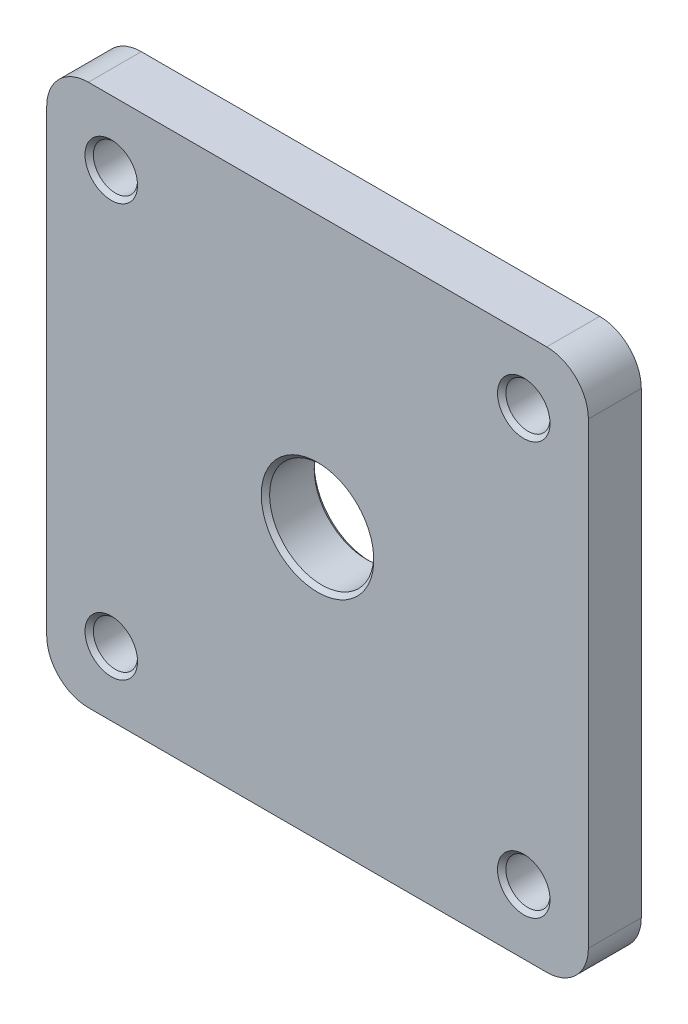
ISO-10303-21;
HEADER;
FILE_DESCRIPTION(('STEP AP214'),'2;1');
FILE_NAME('part.step','',(''),(''),'','','');
FILE_SCHEMA(('AUTOMOTIVE_DESIGN { 1 0 10303 214 1 1 1 1 }'));
ENDSEC;
DATA;
#1=APPLICATION_CONTEXT('core data for automotive mechanical design processes');
#2=APPLICATION_PROTOCOL_DEFINITION('international standard','automotive_design',2000,#1);
#3=PRODUCT_CONTEXT('',#1,'mechanical');
#4=PRODUCT('Part','Part','',(#3));
#5=PRODUCT_RELATED_PRODUCT_CATEGORY('part','',(#4));
#6=PRODUCT_DEFINITION_FORMATION('','',#4);
#7=PRODUCT_DEFINITION_CONTEXT('part definition',#1,'design');
#8=PRODUCT_DEFINITION('design','',#6,#7);
#9=PRODUCT_DEFINITION_SHAPE('','',#8);
#10=(LENGTH_UNIT() NAMED_UNIT(*) SI_UNIT(.MILLI.,.METRE.));
#11=(NAMED_UNIT(*) PLANE_ANGLE_UNIT() SI_UNIT($,.RADIAN.));
#12=(NAMED_UNIT(*) SI_UNIT($,.STERADIAN.) SOLID_ANGLE_UNIT());
#13=UNCERTAINTY_MEASURE_WITH_UNIT(LENGTH_MEASURE(1.E-05),#10,'distance_accuracy_value','');
#14=(GEOMETRIC_REPRESENTATION_CONTEXT(3) GLOBAL_UNCERTAINTY_ASSIGNED_CONTEXT((#13)) GLOBAL_UNIT_ASSIGNED_CONTEXT((#10,
#11,#12)) REPRESENTATION_CONTEXT('',''));
#15=CARTESIAN_POINT('',(0.,0.,0.));
#16=DIRECTION('',(0.,0.,1.));
#17=DIRECTION('',(1.,0.,0.));
#18=AXIS2_PLACEMENT_3D('',#15,#16,#17);
#19=CARTESIAN_POINT('',(0.,0.,3.175));
#20=DIRECTION('',(0.,0.,-1.));
#21=DIRECTION('',(-1.,0.,0.));
#22=AXIS2_PLACEMENT_3D('',#19,#20,#21);
#23=PLANE('',#22);
#24=CARTESIAN_POINT('',(-24.7487373415291,-24.7487373415292,3.175));
#25=DIRECTION('',(0.,0.,-1.));
#26=DIRECTION('',(-1.,0.,0.));
#27=AXIS2_PLACEMENT_3D('',#24,#25,#26);
#28=CIRCLE('',#27,3.14999999999999);
#29=CARTESIAN_POINT('',(-27.8987373415291,-24.7487373415292,3.175));
#30=VERTEX_POINT('',#29);
#31=EDGE_CURVE('E232',#30,#30,#28,.T.);
#32=ORIENTED_EDGE('',*,*,#31,.T.);
#33=EDGE_LOOP('',(#32));
#34=FACE_BOUND('',#33,.T.);
#35=CARTESIAN_POINT('',(24.7487373415292,-24.7487373415291,3.175));
#36=DIRECTION('',(0.,0.,-1.));
#37=DIRECTION('',(-1.,0.,0.));
#38=AXIS2_PLACEMENT_3D('',#35,#36,#37);
#39=CIRCLE('',#38,3.14999999999999);
#40=CARTESIAN_POINT('',(21.5987373415292,-24.7487373415291,3.175));
#41=VERTEX_POINT('',#40);
#42=EDGE_CURVE('E228',#41,#41,#39,.T.);
#43=ORIENTED_EDGE('',*,*,#42,.T.);
#44=EDGE_LOOP('',(#43));
#45=FACE_BOUND('',#44,.T.);
#46=CARTESIAN_POINT('',(24.7487373415291,24.7487373415292,3.175));
#47=DIRECTION('',(0.,0.,-1.));
#48=DIRECTION('',(-1.,0.,0.));
#49=AXIS2_PLACEMENT_3D('',#46,#47,#48);
#50=CIRCLE('',#49,3.14999999999999);
#51=CARTESIAN_POINT('',(21.5987373415291,24.7487373415292,3.175));
#52=VERTEX_POINT('',#51);
#53=EDGE_CURVE('E224',#52,#52,#50,.T.);
#54=ORIENTED_EDGE('',*,*,#53,.T.);
#55=EDGE_LOOP('',(#54));
#56=FACE_BOUND('',#55,.T.);
#57=CARTESIAN_POINT('',(-24.7487373415292,24.7487373415291,3.175));
#58=DIRECTION('',(0.,0.,-1.));
#59=DIRECTION('',(-1.,0.,0.));
#60=AXIS2_PLACEMENT_3D('',#57,#58,#59);
#61=CIRCLE('',#60,3.14999999999999);
#62=CARTESIAN_POINT('',(-27.8987373415292,24.7487373415291,3.175));
#63=VERTEX_POINT('',#62);
#64=EDGE_CURVE('E220',#63,#63,#61,.T.);
#65=ORIENTED_EDGE('',*,*,#64,.T.);
#66=EDGE_LOOP('',(#65));
#67=FACE_BOUND('',#66,.T.);
#68=CARTESIAN_POINT('',(0.,0.,3.175));
#69=DIRECTION('',(0.,0.,-1.));
#70=DIRECTION('',(-1.,0.,0.));
#71=AXIS2_PLACEMENT_3D('',#68,#69,#70);
#72=CIRCLE('',#71,6.75000000000001);
#73=CARTESIAN_POINT('',(-6.75000000000001,0.,3.175));
#74=VERTEX_POINT('',#73);
#75=EDGE_CURVE('E216',#74,#74,#72,.T.);
#76=ORIENTED_EDGE('',*,*,#75,.T.);
#77=EDGE_LOOP('',(#76));
#78=FACE_BOUND('',#77,.T.);
#79=DIRECTION('',(0.,-1.,0.));
#80=VECTOR('',#79,1.);
#81=CARTESIAN_POINT('',(-32.5,-32.5,3.175));
#82=LINE('',#81,#80);
#83=CARTESIAN_POINT('',(-32.5,27.5,3.175));
#84=VERTEX_POINT('',#83);
#85=CARTESIAN_POINT('',(-32.5,-27.5,3.175));
#86=VERTEX_POINT('',#85);
#87=EDGE_CURVE('E613',#84,#86,#82,.T.);
#88=ORIENTED_EDGE('',*,*,#87,.T.);
#89=CARTESIAN_POINT('',(-27.5,-27.5,3.175));
#90=DIRECTION('',(0.,0.,-1.));
#91=DIRECTION('',(-1.,0.,0.));
#92=AXIS2_PLACEMENT_3D('',#89,#90,#91);
#93=CIRCLE('',#92,5.);
#94=CARTESIAN_POINT('',(-27.5,-32.5,3.175));
#95=VERTEX_POINT('',#94);
#96=EDGE_CURVE('E172',#86,#95,#93,.F.);
#97=ORIENTED_EDGE('',*,*,#96,.T.);
#98=DIRECTION('',(1.,0.,0.));
#99=VECTOR('',#98,1.);
#100=CARTESIAN_POINT('',(-32.5,-32.5,3.175));
#101=LINE('',#100,#99);
#102=CARTESIAN_POINT('',(27.5,-32.5,3.175));
#103=VERTEX_POINT('',#102);
#104=EDGE_CURVE('E130',#95,#103,#101,.T.);
#105=ORIENTED_EDGE('',*,*,#104,.T.);
#106=CARTESIAN_POINT('',(27.5,-27.5,3.175));
#107=DIRECTION('',(0.,0.,-1.));
#108=DIRECTION('',(-1.,0.,0.));
#109=AXIS2_PLACEMENT_3D('',#106,#107,#108);
#110=CIRCLE('',#109,5.);
#111=CARTESIAN_POINT('',(32.5,-27.5,3.175));
#112=VERTEX_POINT('',#111);
#113=EDGE_CURVE('E166',#103,#112,#110,.F.);
#114=ORIENTED_EDGE('',*,*,#113,.T.);
#115=DIRECTION('',(0.,1.,0.));
#116=VECTOR('',#115,1.);
#117=CARTESIAN_POINT('',(32.5,-32.5,3.175));
#118=LINE('',#117,#116);
#119=CARTESIAN_POINT('',(32.5,27.5,3.175));
#120=VERTEX_POINT('',#119);
#121=EDGE_CURVE('E139',#112,#120,#118,.T.);
#122=ORIENTED_EDGE('',*,*,#121,.T.);
#123=CARTESIAN_POINT('',(27.5,27.5,3.175));
#124=DIRECTION('',(0.,0.,-1.));
#125=DIRECTION('',(-1.,0.,0.));
#126=AXIS2_PLACEMENT_3D('',#123,#124,#125);
#127=CIRCLE('',#126,5.);
#128=CARTESIAN_POINT('',(27.5,32.5,3.175));
#129=VERTEX_POINT('',#128);
#130=EDGE_CURVE('E64',#120,#129,#127,.F.);
#131=ORIENTED_EDGE('',*,*,#130,.T.);
#132=DIRECTION('',(-1.,0.,0.));
#133=VECTOR('',#132,1.);
#134=CARTESIAN_POINT('',(-32.5,32.5,3.175));
#135=LINE('',#134,#133);
#136=CARTESIAN_POINT('',(-27.5,32.5,3.175));
#137=VERTEX_POINT('',#136);
#138=EDGE_CURVE('E145',#129,#137,#135,.T.);
#139=ORIENTED_EDGE('',*,*,#138,.T.);
#140=CARTESIAN_POINT('',(-27.5,27.5,3.175));
#141=DIRECTION('',(0.,0.,-1.));
#142=DIRECTION('',(-1.,0.,0.));
#143=AXIS2_PLACEMENT_3D('',#140,#141,#142);
#144=CIRCLE('',#143,5.);
#145=EDGE_CURVE('E169',#137,#84,#144,.F.);
#146=ORIENTED_EDGE('',*,*,#145,.T.);
#147=EDGE_LOOP('',(#88,#97,#105,#114,#122,#131,#139,#146));
#148=FACE_BOUND('',#147,.T.);
#149=ADVANCED_FACE('F40',(#34,#45,#56,#67,#78,#148),#23,.F.);
#150=CARTESIAN_POINT('',(32.5,-32.5,3.175));
#151=DIRECTION('',(-1.,0.,0.));
#152=DIRECTION('',(0.,0.,1.));
#153=AXIS2_PLACEMENT_3D('',#150,#151,#152);
#154=PLANE('',#153);
#155=ORIENTED_EDGE('',*,*,#121,.F.);
#156=DIRECTION('',(0.,0.,-1.));
#157=VECTOR('',#156,1.);
#158=CARTESIAN_POINT('',(32.5,-27.5,3.175));
#159=LINE('',#158,#157);
#160=CARTESIAN_POINT('',(32.5,-27.5,-3.175));
#161=VERTEX_POINT('',#160);
#162=EDGE_CURVE('E184',#112,#161,#159,.T.);
#163=ORIENTED_EDGE('',*,*,#162,.T.);
#164=DIRECTION('',(0.,1.,0.));
#165=VECTOR('',#164,1.);
#166=CARTESIAN_POINT('',(32.5,-32.5,-3.175));
#167=LINE('',#166,#165);
#168=CARTESIAN_POINT('',(32.5,27.5,-3.175));
#169=VERTEX_POINT('',#168);
#170=EDGE_CURVE('E624',#161,#169,#167,.T.);
#171=ORIENTED_EDGE('',*,*,#170,.T.);
#172=DIRECTION('',(0.,0.,-1.));
#173=VECTOR('',#172,1.);
#174=CARTESIAN_POINT('',(32.5,27.5,3.175));
#175=LINE('',#174,#173);
#176=EDGE_CURVE('E181',#169,#120,#175,.F.);
#177=ORIENTED_EDGE('',*,*,#176,.T.);
#178=EDGE_LOOP('',(#155,#163,#171,#177));
#179=FACE_BOUND('',#178,.T.);
#180=ADVANCED_FACE('F276',(#179),#154,.F.);
#181=CARTESIAN_POINT('',(-32.5,32.5,3.175));
#182=DIRECTION('',(0.,-1.,0.));
#183=DIRECTION('',(0.,0.,-1.));
#184=AXIS2_PLACEMENT_3D('',#181,#182,#183);
#185=PLANE('',#184);
#186=DIRECTION('',(-1.,0.,0.));
#187=VECTOR('',#186,1.);
#188=CARTESIAN_POINT('',(-32.5,32.5,-3.175));
#189=LINE('',#188,#187);
#190=CARTESIAN_POINT('',(27.5,32.5,-3.175));
#191=VERTEX_POINT('',#190);
#192=CARTESIAN_POINT('',(-27.5,32.5,-3.175));
#193=VERTEX_POINT('',#192);
#194=EDGE_CURVE('E147',#191,#193,#189,.T.);
#195=ORIENTED_EDGE('',*,*,#194,.T.);
#196=DIRECTION('',(0.,0.,-1.));
#197=VECTOR('',#196,1.);
#198=CARTESIAN_POINT('',(-27.5,32.5,3.175));
#199=LINE('',#198,#197);
#200=EDGE_CURVE('E57',#193,#137,#199,.F.);
#201=ORIENTED_EDGE('',*,*,#200,.T.);
#202=ORIENTED_EDGE('',*,*,#138,.F.);
#203=DIRECTION('',(0.,0.,-1.));
#204=VECTOR('',#203,1.);
#205=CARTESIAN_POINT('',(27.5,32.5,3.175));
#206=LINE('',#205,#204);
#207=EDGE_CURVE('E175',#129,#191,#206,.T.);
#208=ORIENTED_EDGE('',*,*,#207,.T.);
#209=EDGE_LOOP('',(#195,#201,#202,#208));
#210=FACE_BOUND('',#209,.T.);
#211=ADVANCED_FACE('F282',(#210),#185,.F.);
#212=CARTESIAN_POINT('',(-32.5,-32.5,3.175));
#213=DIRECTION('',(1.,0.,0.));
#214=DIRECTION('',(0.,0.,-1.));
#215=AXIS2_PLACEMENT_3D('',#212,#213,#214);
#216=PLANE('',#215);
#217=DIRECTION('',(0.,-1.,0.));
#218=VECTOR('',#217,1.);
#219=CARTESIAN_POINT('',(-32.5,-32.5,-3.175));
#220=LINE('',#219,#218);
#221=CARTESIAN_POINT('',(-32.5,27.5,-3.175));
#222=VERTEX_POINT('',#221);
#223=CARTESIAN_POINT('',(-32.5,-27.5,-3.175));
#224=VERTEX_POINT('',#223);
#225=EDGE_CURVE('E140',#222,#224,#220,.T.);
#226=ORIENTED_EDGE('',*,*,#225,.T.);
#227=DIRECTION('',(0.,0.,-1.));
#228=VECTOR('',#227,1.);
#229=CARTESIAN_POINT('',(-32.5,-27.5,3.175));
#230=LINE('',#229,#228);
#231=EDGE_CURVE('E114',#224,#86,#230,.F.);
#232=ORIENTED_EDGE('',*,*,#231,.T.);
#233=ORIENTED_EDGE('',*,*,#87,.F.);
#234=DIRECTION('',(0.,0.,-1.));
#235=VECTOR('',#234,1.);
#236=CARTESIAN_POINT('',(-32.5,27.5,3.175));
#237=LINE('',#236,#235);
#238=EDGE_CURVE('E120',#84,#222,#237,.T.);
#239=ORIENTED_EDGE('',*,*,#238,.T.);
#240=EDGE_LOOP('',(#226,#232,#233,#239));
#241=FACE_BOUND('',#240,.T.);
#242=ADVANCED_FACE('F294',(#241),#216,.F.);
#243=CARTESIAN_POINT('',(-32.5,-32.5,3.175));
#244=DIRECTION('',(0.,1.,0.));
#245=DIRECTION('',(0.,0.,1.));
#246=AXIS2_PLACEMENT_3D('',#243,#244,#245);
#247=PLANE('',#246);
#248=ORIENTED_EDGE('',*,*,#104,.F.);
#249=DIRECTION('',(0.,0.,-1.));
#250=VECTOR('',#249,1.);
#251=CARTESIAN_POINT('',(-27.5,-32.5,3.175));
#252=LINE('',#251,#250);
#253=CARTESIAN_POINT('',(-27.5,-32.5,-3.175));
#254=VERTEX_POINT('',#253);
#255=EDGE_CURVE('E113',#95,#254,#252,.T.);
#256=ORIENTED_EDGE('',*,*,#255,.T.);
#257=DIRECTION('',(1.,0.,0.));
#258=VECTOR('',#257,1.);
#259=CARTESIAN_POINT('',(-32.5,-32.5,-3.175));
#260=LINE('',#259,#258);
#261=CARTESIAN_POINT('',(27.5,-32.5,-3.175));
#262=VERTEX_POINT('',#261);
#263=EDGE_CURVE('E127',#254,#262,#260,.T.);
#264=ORIENTED_EDGE('',*,*,#263,.T.);
#265=DIRECTION('',(0.,0.,-1.));
#266=VECTOR('',#265,1.);
#267=CARTESIAN_POINT('',(27.5,-32.5,3.175));
#268=LINE('',#267,#266);
#269=EDGE_CURVE('E133',#262,#103,#268,.F.);
#270=ORIENTED_EDGE('',*,*,#269,.T.);
#271=EDGE_LOOP('',(#248,#256,#264,#270));
#272=FACE_BOUND('',#271,.T.);
#273=ADVANCED_FACE('F126',(#272),#247,.F.);
#274=CARTESIAN_POINT('',(0.,0.,-3.175));
#275=DIRECTION('',(0.,0.,-1.));
#276=DIRECTION('',(-1.,0.,0.));
#277=AXIS2_PLACEMENT_3D('',#274,#275,#276);
#278=PLANE('',#277);
#279=CARTESIAN_POINT('',(-24.7487373415291,-24.7487373415292,-3.175));
#280=DIRECTION('',(0.,0.,-1.));
#281=DIRECTION('',(-1.,0.,0.));
#282=AXIS2_PLACEMENT_3D('',#279,#280,#281);
#283=CIRCLE('',#282,3.15);
#284=CARTESIAN_POINT('',(-27.8987373415291,-24.7487373415292,-3.175));
#285=VERTEX_POINT('',#284);
#286=EDGE_CURVE('E212',#285,#285,#283,.F.);
#287=ORIENTED_EDGE('',*,*,#286,.T.);
#288=EDGE_LOOP('',(#287));
#289=FACE_BOUND('',#288,.T.);
#290=CARTESIAN_POINT('',(24.7487373415292,-24.7487373415291,-3.175));
#291=DIRECTION('',(0.,0.,-1.));
#292=DIRECTION('',(-1.,0.,0.));
#293=AXIS2_PLACEMENT_3D('',#290,#291,#292);
#294=CIRCLE('',#293,3.15);
#295=CARTESIAN_POINT('',(21.5987373415292,-24.7487373415291,-3.175));
#296=VERTEX_POINT('',#295);
#297=EDGE_CURVE('E208',#296,#296,#294,.F.);
#298=ORIENTED_EDGE('',*,*,#297,.T.);
#299=EDGE_LOOP('',(#298));
#300=FACE_BOUND('',#299,.T.);
#301=CARTESIAN_POINT('',(24.7487373415291,24.7487373415292,-3.175));
#302=DIRECTION('',(0.,0.,-1.));
#303=DIRECTION('',(-1.,0.,0.));
#304=AXIS2_PLACEMENT_3D('',#301,#302,#303);
#305=CIRCLE('',#304,3.15);
#306=CARTESIAN_POINT('',(21.5987373415291,24.7487373415292,-3.175));
#307=VERTEX_POINT('',#306);
#308=EDGE_CURVE('E204',#307,#307,#305,.F.);
#309=ORIENTED_EDGE('',*,*,#308,.T.);
#310=EDGE_LOOP('',(#309));
#311=FACE_BOUND('',#310,.T.);
#312=CARTESIAN_POINT('',(-24.7487373415292,24.7487373415291,-3.175));
#313=DIRECTION('',(0.,0.,-1.));
#314=DIRECTION('',(-1.,0.,0.));
#315=AXIS2_PLACEMENT_3D('',#312,#313,#314);
#316=CIRCLE('',#315,3.15);
#317=CARTESIAN_POINT('',(-27.8987373415292,24.7487373415291,-3.175));
#318=VERTEX_POINT('',#317);
#319=EDGE_CURVE('E200',#318,#318,#316,.F.);
#320=ORIENTED_EDGE('',*,*,#319,.T.);
#321=EDGE_LOOP('',(#320));
#322=FACE_BOUND('',#321,.T.);
#323=CARTESIAN_POINT('',(0.,0.,-3.175));
#324=DIRECTION('',(0.,0.,-1.));
#325=DIRECTION('',(-1.,0.,0.));
#326=AXIS2_PLACEMENT_3D('',#323,#324,#325);
#327=CIRCLE('',#326,6.75000000000001);
#328=CARTESIAN_POINT('',(-6.75000000000001,0.,-3.175));
#329=VERTEX_POINT('',#328);
#330=EDGE_CURVE('E196',#329,#329,#327,.F.);
#331=ORIENTED_EDGE('',*,*,#330,.T.);
#332=EDGE_LOOP('',(#331));
#333=FACE_BOUND('',#332,.T.);
#334=ORIENTED_EDGE('',*,*,#263,.F.);
#335=CARTESIAN_POINT('',(-27.5,-27.5,-3.175));
#336=DIRECTION('',(0.,0.,-1.));
#337=DIRECTION('',(-1.,0.,0.));
#338=AXIS2_PLACEMENT_3D('',#335,#336,#337);
#339=CIRCLE('',#338,5.);
#340=EDGE_CURVE('E109',#254,#224,#339,.T.);
#341=ORIENTED_EDGE('',*,*,#340,.T.);
#342=ORIENTED_EDGE('',*,*,#225,.F.);
#343=CARTESIAN_POINT('',(-27.5,27.5,-3.175));
#344=DIRECTION('',(0.,0.,-1.));
#345=DIRECTION('',(-1.,0.,0.));
#346=AXIS2_PLACEMENT_3D('',#343,#344,#345);
#347=CIRCLE('',#346,5.);
#348=EDGE_CURVE('E121',#222,#193,#347,.T.);
#349=ORIENTED_EDGE('',*,*,#348,.T.);
#350=ORIENTED_EDGE('',*,*,#194,.F.);
#351=CARTESIAN_POINT('',(27.5,27.5,-3.175));
#352=DIRECTION('',(0.,0.,-1.));
#353=DIRECTION('',(-1.,0.,0.));
#354=AXIS2_PLACEMENT_3D('',#351,#352,#353);
#355=CIRCLE('',#354,5.);
#356=EDGE_CURVE('E132',#191,#169,#355,.T.);
#357=ORIENTED_EDGE('',*,*,#356,.T.);
#358=ORIENTED_EDGE('',*,*,#170,.F.);
#359=CARTESIAN_POINT('',(27.5,-27.5,-3.175));
#360=DIRECTION('',(0.,0.,-1.));
#361=DIRECTION('',(-1.,0.,0.));
#362=AXIS2_PLACEMENT_3D('',#359,#360,#361);
#363=CIRCLE('',#362,5.);
#364=EDGE_CURVE('E137',#161,#262,#363,.T.);
#365=ORIENTED_EDGE('',*,*,#364,.T.);
#366=EDGE_LOOP('',(#334,#341,#342,#349,#350,#357,#358,#365));
#367=FACE_BOUND('',#366,.T.);
#368=ADVANCED_FACE('F135',(#289,#300,#311,#322,#333,#367),#278,.T.);
#369=CARTESIAN_POINT('',(0.,0.,3.175));
#370=DIRECTION('',(0.,0.,1.));
#371=DIRECTION('',(1.,0.,0.));
#372=AXIS2_PLACEMENT_3D('',#369,#370,#371);
#373=CYLINDRICAL_SURFACE('',#372,6.25);
#374=CARTESIAN_POINT('',(0.,0.,-2.675));
#375=DIRECTION('',(0.,0.,-1.));
#376=DIRECTION('',(-1.,0.,0.));
#377=AXIS2_PLACEMENT_3D('',#374,#375,#376);
#378=CIRCLE('',#377,6.25);
#379=CARTESIAN_POINT('',(-6.25,0.,-2.675));
#380=VERTEX_POINT('',#379);
#381=EDGE_CURVE('E11',#380,#380,#378,.T.);
#382=ORIENTED_EDGE('',*,*,#381,.T.);
#383=EDGE_LOOP('',(#382));
#384=FACE_BOUND('',#383,.T.);
#385=CARTESIAN_POINT('',(0.,0.,2.675));
#386=DIRECTION('',(0.,0.,-1.));
#387=DIRECTION('',(-1.,0.,0.));
#388=AXIS2_PLACEMENT_3D('',#385,#386,#387);
#389=CIRCLE('',#388,6.25);
#390=CARTESIAN_POINT('',(-6.25,0.,2.675));
#391=VERTEX_POINT('',#390);
#392=EDGE_CURVE('E50',#391,#391,#389,.F.);
#393=ORIENTED_EDGE('',*,*,#392,.T.);
#394=EDGE_LOOP('',(#393));
#395=FACE_BOUND('',#394,.T.);
#396=ADVANCED_FACE('F264',(#384,#395),#373,.F.);
#397=CARTESIAN_POINT('',(24.7487373415292,-24.7487373415291,3.175));
#398=DIRECTION('',(0.,0.,1.));
#399=DIRECTION('',(1.,0.,0.));
#400=AXIS2_PLACEMENT_3D('',#397,#398,#399);
#401=CYLINDRICAL_SURFACE('',#400,2.65);
#402=CARTESIAN_POINT('',(24.7487373415292,-24.7487373415291,-2.675));
#403=DIRECTION('',(0.,0.,-1.));
#404=DIRECTION('',(-1.,0.,0.));
#405=AXIS2_PLACEMENT_3D('',#402,#403,#404);
#406=CIRCLE('',#405,2.65);
#407=CARTESIAN_POINT('',(22.0987373415292,-24.7487373415291,-2.675));
#408=VERTEX_POINT('',#407);
#409=EDGE_CURVE('E240',#408,#408,#406,.T.);
#410=ORIENTED_EDGE('',*,*,#409,.T.);
#411=EDGE_LOOP('',(#410));
#412=FACE_BOUND('',#411,.T.);
#413=CARTESIAN_POINT('',(24.7487373415292,-24.7487373415291,2.67500000000002));
#414=DIRECTION('',(0.,0.,-1.));
#415=DIRECTION('',(-1.,0.,0.));
#416=AXIS2_PLACEMENT_3D('',#413,#414,#415);
#417=CIRCLE('',#416,2.65);
#418=CARTESIAN_POINT('',(22.0987373415292,-24.7487373415291,2.67500000000002));
#419=VERTEX_POINT('',#418);
#420=EDGE_CURVE('E236',#419,#419,#417,.F.);
#421=ORIENTED_EDGE('',*,*,#420,.T.);
#422=EDGE_LOOP('',(#421));
#423=FACE_BOUND('',#422,.T.);
#424=ADVANCED_FACE('F391',(#412,#423),#401,.F.);
#425=CARTESIAN_POINT('',(-24.7487373415291,-24.7487373415292,3.175));
#426=DIRECTION('',(0.,0.,1.));
#427=DIRECTION('',(1.,0.,0.));
#428=AXIS2_PLACEMENT_3D('',#425,#426,#427);
#429=CYLINDRICAL_SURFACE('',#428,2.65);
#430=CARTESIAN_POINT('',(-24.7487373415291,-24.7487373415292,-2.675));
#431=DIRECTION('',(0.,0.,-1.));
#432=DIRECTION('',(-1.,0.,0.));
#433=AXIS2_PLACEMENT_3D('',#430,#431,#432);
#434=CIRCLE('',#433,2.65);
#435=CARTESIAN_POINT('',(-27.3987373415291,-24.7487373415292,-2.675));
#436=VERTEX_POINT('',#435);
#437=EDGE_CURVE('E192',#436,#436,#434,.T.);
#438=ORIENTED_EDGE('',*,*,#437,.T.);
#439=EDGE_LOOP('',(#438));
#440=FACE_BOUND('',#439,.T.);
#441=CARTESIAN_POINT('',(-24.7487373415291,-24.7487373415292,2.67500000000002));
#442=DIRECTION('',(0.,0.,-1.));
#443=DIRECTION('',(-1.,0.,0.));
#444=AXIS2_PLACEMENT_3D('',#441,#442,#443);
#445=CIRCLE('',#444,2.65);
#446=CARTESIAN_POINT('',(-27.3987373415291,-24.7487373415292,2.67500000000002));
#447=VERTEX_POINT('',#446);
#448=EDGE_CURVE('E188',#447,#447,#445,.F.);
#449=ORIENTED_EDGE('',*,*,#448,.T.);
#450=EDGE_LOOP('',(#449));
#451=FACE_BOUND('',#450,.T.);
#452=ADVANCED_FACE('F382',(#440,#451),#429,.F.);
#453=CARTESIAN_POINT('',(-24.7487373415292,24.7487373415291,3.175));
#454=DIRECTION('',(0.,0.,1.));
#455=DIRECTION('',(1.,0.,0.));
#456=AXIS2_PLACEMENT_3D('',#453,#454,#455);
#457=CYLINDRICAL_SURFACE('',#456,2.65);
#458=CARTESIAN_POINT('',(-24.7487373415292,24.7487373415291,-2.675));
#459=DIRECTION('',(0.,0.,-1.));
#460=DIRECTION('',(-1.,0.,0.));
#461=AXIS2_PLACEMENT_3D('',#458,#459,#460);
#462=CIRCLE('',#461,2.65);
#463=CARTESIAN_POINT('',(-27.3987373415292,24.7487373415291,-2.675));
#464=VERTEX_POINT('',#463);
#465=EDGE_CURVE('E256',#464,#464,#462,.T.);
#466=ORIENTED_EDGE('',*,*,#465,.T.);
#467=EDGE_LOOP('',(#466));
#468=FACE_BOUND('',#467,.T.);
#469=CARTESIAN_POINT('',(-24.7487373415292,24.7487373415291,2.67500000000002));
#470=DIRECTION('',(0.,0.,-1.));
#471=DIRECTION('',(-1.,0.,0.));
#472=AXIS2_PLACEMENT_3D('',#469,#470,#471);
#473=CIRCLE('',#472,2.65);
#474=CARTESIAN_POINT('',(-27.3987373415292,24.7487373415291,2.67500000000002));
#475=VERTEX_POINT('',#474);
#476=EDGE_CURVE('E252',#475,#475,#473,.F.);
#477=ORIENTED_EDGE('',*,*,#476,.T.);
#478=EDGE_LOOP('',(#477));
#479=FACE_BOUND('',#478,.T.);
#480=ADVANCED_FACE('F380',(#468,#479),#457,.F.);
#481=CARTESIAN_POINT('',(24.7487373415291,24.7487373415292,3.175));
#482=DIRECTION('',(0.,0.,1.));
#483=DIRECTION('',(1.,0.,0.));
#484=AXIS2_PLACEMENT_3D('',#481,#482,#483);
#485=CYLINDRICAL_SURFACE('',#484,2.65);
#486=CARTESIAN_POINT('',(24.7487373415291,24.7487373415292,-2.675));
#487=DIRECTION('',(0.,0.,-1.));
#488=DIRECTION('',(-1.,0.,0.));
#489=AXIS2_PLACEMENT_3D('',#486,#487,#488);
#490=CIRCLE('',#489,2.65);
#491=CARTESIAN_POINT('',(22.0987373415291,24.7487373415292,-2.675));
#492=VERTEX_POINT('',#491);
#493=EDGE_CURVE('E248',#492,#492,#490,.T.);
#494=ORIENTED_EDGE('',*,*,#493,.T.);
#495=EDGE_LOOP('',(#494));
#496=FACE_BOUND('',#495,.T.);
#497=CARTESIAN_POINT('',(24.7487373415291,24.7487373415292,2.67500000000002));
#498=DIRECTION('',(0.,0.,-1.));
#499=DIRECTION('',(-1.,0.,0.));
#500=AXIS2_PLACEMENT_3D('',#497,#498,#499);
#501=CIRCLE('',#500,2.65);
#502=CARTESIAN_POINT('',(22.0987373415291,24.7487373415292,2.67500000000002));
#503=VERTEX_POINT('',#502);
#504=EDGE_CURVE('E244',#503,#503,#501,.F.);
#505=ORIENTED_EDGE('',*,*,#504,.T.);
#506=EDGE_LOOP('',(#505));
#507=FACE_BOUND('',#506,.T.);
#508=ADVANCED_FACE('F303',(#496,#507),#485,.F.);
#509=CARTESIAN_POINT('',(-27.5,-27.5,3.175));
#510=DIRECTION('',(0.,0.,-1.));
#511=DIRECTION('',(-1.,0.,0.));
#512=AXIS2_PLACEMENT_3D('',#509,#510,#511);
#513=CYLINDRICAL_SURFACE('',#512,5.);
#514=ORIENTED_EDGE('',*,*,#96,.F.);
#515=ORIENTED_EDGE('',*,*,#231,.F.);
#516=ORIENTED_EDGE('',*,*,#340,.F.);
#517=ORIENTED_EDGE('',*,*,#255,.F.);
#518=EDGE_LOOP('',(#514,#515,#516,#517));
#519=FACE_BOUND('',#518,.T.);
#520=ADVANCED_FACE('F112',(#519),#513,.T.);
#521=CARTESIAN_POINT('',(-27.5,27.5,3.175));
#522=DIRECTION('',(0.,0.,-1.));
#523=DIRECTION('',(-1.,0.,0.));
#524=AXIS2_PLACEMENT_3D('',#521,#522,#523);
#525=CYLINDRICAL_SURFACE('',#524,5.);
#526=ORIENTED_EDGE('',*,*,#145,.F.);
#527=ORIENTED_EDGE('',*,*,#200,.F.);
#528=ORIENTED_EDGE('',*,*,#348,.F.);
#529=ORIENTED_EDGE('',*,*,#238,.F.);
#530=EDGE_LOOP('',(#526,#527,#528,#529));
#531=FACE_BOUND('',#530,.T.);
#532=ADVANCED_FACE('F302',(#531),#525,.T.);
#533=CARTESIAN_POINT('',(27.5,-27.5,3.175));
#534=DIRECTION('',(0.,0.,-1.));
#535=DIRECTION('',(-1.,0.,0.));
#536=AXIS2_PLACEMENT_3D('',#533,#534,#535);
#537=CYLINDRICAL_SURFACE('',#536,5.);
#538=ORIENTED_EDGE('',*,*,#113,.F.);
#539=ORIENTED_EDGE('',*,*,#269,.F.);
#540=ORIENTED_EDGE('',*,*,#364,.F.);
#541=ORIENTED_EDGE('',*,*,#162,.F.);
#542=EDGE_LOOP('',(#538,#539,#540,#541));
#543=FACE_BOUND('',#542,.T.);
#544=ADVANCED_FACE('F306',(#543),#537,.T.);
#545=CARTESIAN_POINT('',(27.5,27.5,3.175));
#546=DIRECTION('',(0.,0.,-1.));
#547=DIRECTION('',(-1.,0.,0.));
#548=AXIS2_PLACEMENT_3D('',#545,#546,#547);
#549=CYLINDRICAL_SURFACE('',#548,5.);
#550=ORIENTED_EDGE('',*,*,#130,.F.);
#551=ORIENTED_EDGE('',*,*,#176,.F.);
#552=ORIENTED_EDGE('',*,*,#356,.F.);
#553=ORIENTED_EDGE('',*,*,#207,.F.);
#554=EDGE_LOOP('',(#550,#551,#552,#553));
#555=FACE_BOUND('',#554,.T.);
#556=ADVANCED_FACE('F310',(#555),#549,.T.);
#557=CARTESIAN_POINT('',(-24.7487373415291,-24.7487373415292,-2.675));
#558=DIRECTION('',(0.,0.,-1.));
#559=DIRECTION('',(-1.,0.,0.));
#560=AXIS2_PLACEMENT_3D('',#557,#558,#559);
#561=CONICAL_SURFACE('',#560,2.65,0.785398163397454);
#562=ORIENTED_EDGE('',*,*,#286,.F.);
#563=EDGE_LOOP('',(#562));
#564=FACE_BOUND('',#563,.T.);
#565=ORIENTED_EDGE('',*,*,#437,.F.);
#566=EDGE_LOOP('',(#565));
#567=FACE_BOUND('',#566,.T.);
#568=ADVANCED_FACE('F314',(#564,#567),#561,.F.);
#569=CARTESIAN_POINT('',(-24.7487373415291,-24.7487373415292,2.67500000000002));
#570=DIRECTION('',(0.,0.,1.));
#571=DIRECTION('',(1.,0.,0.));
#572=AXIS2_PLACEMENT_3D('',#569,#570,#571);
#573=CONICAL_SURFACE('',#572,2.65,0.785398163397453);
#574=ORIENTED_EDGE('',*,*,#31,.F.);
#575=EDGE_LOOP('',(#574));
#576=FACE_BOUND('',#575,.T.);
#577=ORIENTED_EDGE('',*,*,#448,.F.);
#578=EDGE_LOOP('',(#577));
#579=FACE_BOUND('',#578,.T.);
#580=ADVANCED_FACE('F322',(#576,#579),#573,.F.);
#581=CARTESIAN_POINT('',(24.7487373415292,-24.7487373415291,-2.675));
#582=DIRECTION('',(0.,0.,-1.));
#583=DIRECTION('',(-1.,0.,0.));
#584=AXIS2_PLACEMENT_3D('',#581,#582,#583);
#585=CONICAL_SURFACE('',#584,2.65,0.785398163397454);
#586=ORIENTED_EDGE('',*,*,#297,.F.);
#587=EDGE_LOOP('',(#586));
#588=FACE_BOUND('',#587,.T.);
#589=ORIENTED_EDGE('',*,*,#409,.F.);
#590=EDGE_LOOP('',(#589));
#591=FACE_BOUND('',#590,.T.);
#592=ADVANCED_FACE('F329',(#588,#591),#585,.F.);
#593=CARTESIAN_POINT('',(24.7487373415292,-24.7487373415291,2.67500000000002));
#594=DIRECTION('',(0.,0.,1.));
#595=DIRECTION('',(1.,0.,0.));
#596=AXIS2_PLACEMENT_3D('',#593,#594,#595);
#597=CONICAL_SURFACE('',#596,2.65,0.785398163397453);
#598=ORIENTED_EDGE('',*,*,#42,.F.);
#599=EDGE_LOOP('',(#598));
#600=FACE_BOUND('',#599,.T.);
#601=ORIENTED_EDGE('',*,*,#420,.F.);
#602=EDGE_LOOP('',(#601));
#603=FACE_BOUND('',#602,.T.);
#604=ADVANCED_FACE('F336',(#600,#603),#597,.F.);
#605=CARTESIAN_POINT('',(24.7487373415291,24.7487373415292,-2.675));
#606=DIRECTION('',(0.,0.,-1.));
#607=DIRECTION('',(-1.,0.,0.));
#608=AXIS2_PLACEMENT_3D('',#605,#606,#607);
#609=CONICAL_SURFACE('',#608,2.65,0.785398163397454);
#610=ORIENTED_EDGE('',*,*,#308,.F.);
#611=EDGE_LOOP('',(#610));
#612=FACE_BOUND('',#611,.T.);
#613=ORIENTED_EDGE('',*,*,#493,.F.);
#614=EDGE_LOOP('',(#613));
#615=FACE_BOUND('',#614,.T.);
#616=ADVANCED_FACE('F343',(#612,#615),#609,.F.);
#617=CARTESIAN_POINT('',(24.7487373415291,24.7487373415292,2.67500000000002));
#618=DIRECTION('',(0.,0.,1.));
#619=DIRECTION('',(1.,0.,0.));
#620=AXIS2_PLACEMENT_3D('',#617,#618,#619);
#621=CONICAL_SURFACE('',#620,2.65,0.785398163397453);
#622=ORIENTED_EDGE('',*,*,#53,.F.);
#623=EDGE_LOOP('',(#622));
#624=FACE_BOUND('',#623,.T.);
#625=ORIENTED_EDGE('',*,*,#504,.F.);
#626=EDGE_LOOP('',(#625));
#627=FACE_BOUND('',#626,.T.);
#628=ADVANCED_FACE('F350',(#624,#627),#621,.F.);
#629=CARTESIAN_POINT('',(-24.7487373415292,24.7487373415291,-2.675));
#630=DIRECTION('',(0.,0.,-1.));
#631=DIRECTION('',(-1.,0.,0.));
#632=AXIS2_PLACEMENT_3D('',#629,#630,#631);
#633=CONICAL_SURFACE('',#632,2.65,0.785398163397454);
#634=ORIENTED_EDGE('',*,*,#319,.F.);
#635=EDGE_LOOP('',(#634));
#636=FACE_BOUND('',#635,.T.);
#637=ORIENTED_EDGE('',*,*,#465,.F.);
#638=EDGE_LOOP('',(#637));
#639=FACE_BOUND('',#638,.T.);
#640=ADVANCED_FACE('F357',(#636,#639),#633,.F.);
#641=CARTESIAN_POINT('',(-24.7487373415292,24.7487373415291,2.67500000000002));
#642=DIRECTION('',(0.,0.,1.));
#643=DIRECTION('',(1.,0.,0.));
#644=AXIS2_PLACEMENT_3D('',#641,#642,#643);
#645=CONICAL_SURFACE('',#644,2.65,0.785398163397453);
#646=ORIENTED_EDGE('',*,*,#64,.F.);
#647=EDGE_LOOP('',(#646));
#648=FACE_BOUND('',#647,.T.);
#649=ORIENTED_EDGE('',*,*,#476,.F.);
#650=EDGE_LOOP('',(#649));
#651=FACE_BOUND('',#650,.T.);
#652=ADVANCED_FACE('F272',(#648,#651),#645,.F.);
#653=CARTESIAN_POINT('',(0.,0.,-2.675));
#654=DIRECTION('',(0.,0.,-1.));
#655=DIRECTION('',(-1.,0.,0.));
#656=AXIS2_PLACEMENT_3D('',#653,#654,#655);
#657=CONICAL_SURFACE('',#656,6.25,0.785398163397454);
#658=ORIENTED_EDGE('',*,*,#330,.F.);
#659=EDGE_LOOP('',(#658));
#660=FACE_BOUND('',#659,.T.);
#661=ORIENTED_EDGE('',*,*,#381,.F.);
#662=EDGE_LOOP('',(#661));
#663=FACE_BOUND('',#662,.T.);
#664=ADVANCED_FACE('F267',(#660,#663),#657,.F.);
#665=CARTESIAN_POINT('',(0.,0.,2.675));
#666=DIRECTION('',(0.,0.,1.));
#667=DIRECTION('',(1.,0.,0.));
#668=AXIS2_PLACEMENT_3D('',#665,#666,#667);
#669=CONICAL_SURFACE('',#668,6.25,0.785398163397453);
#670=ORIENTED_EDGE('',*,*,#75,.F.);
#671=EDGE_LOOP('',(#670));
#672=FACE_BOUND('',#671,.T.);
#673=ORIENTED_EDGE('',*,*,#392,.F.);
#674=EDGE_LOOP('',(#673));
#675=FACE_BOUND('',#674,.T.);
#676=ADVANCED_FACE('F43',(#672,#675),#669,.F.);
#677=CLOSED_SHELL('',(#149,#180,#211,#242,#273,#368,#396,#424,#452,#480,#508,#520,#532,#544,
#556,#568,#580,#592,#604,#616,#628,#640,#652,#664,#676));
#678=MANIFOLD_SOLID_BREP('B2',#677);
#679=ADVANCED_BREP_SHAPE_REPRESENTATION('',(#18,#678),#14);
#680=SHAPE_DEFINITION_REPRESENTATION(#9,#679);
ENDSEC;
END-ISO-10303-21;
